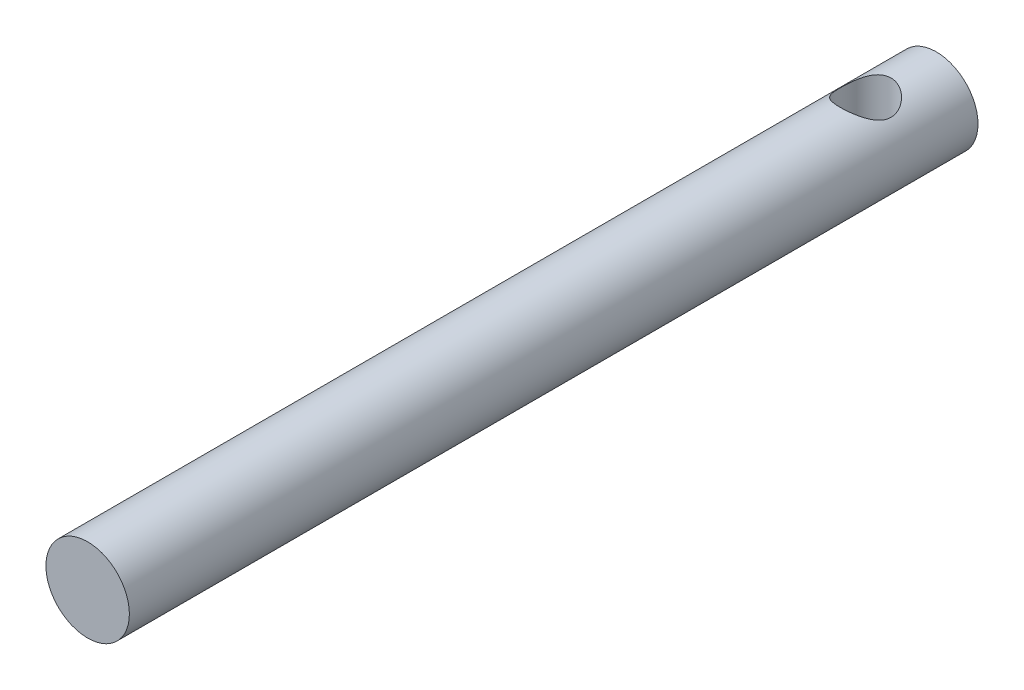
ISO-10303-21;
HEADER;
FILE_DESCRIPTION(('STEP AP214'),'2;1');
FILE_NAME('part.step','',(''),(''),'','','');
FILE_SCHEMA(('AUTOMOTIVE_DESIGN { 1 0 10303 214 1 1 1 1 }'));
ENDSEC;
DATA;
#1=APPLICATION_CONTEXT('core data for automotive mechanical design processes');
#2=APPLICATION_PROTOCOL_DEFINITION('international standard','automotive_design',2000,#1);
#3=PRODUCT_CONTEXT('',#1,'mechanical');
#4=PRODUCT('Part','Part','',(#3));
#5=PRODUCT_RELATED_PRODUCT_CATEGORY('part','',(#4));
#6=PRODUCT_DEFINITION_FORMATION('','',#4);
#7=PRODUCT_DEFINITION_CONTEXT('part definition',#1,'design');
#8=PRODUCT_DEFINITION('design','',#6,#7);
#9=PRODUCT_DEFINITION_SHAPE('','',#8);
#10=(LENGTH_UNIT() NAMED_UNIT(*) SI_UNIT(.MILLI.,.METRE.));
#11=(NAMED_UNIT(*) PLANE_ANGLE_UNIT() SI_UNIT($,.RADIAN.));
#12=(NAMED_UNIT(*) SI_UNIT($,.STERADIAN.) SOLID_ANGLE_UNIT());
#13=UNCERTAINTY_MEASURE_WITH_UNIT(LENGTH_MEASURE(1.E-05),#10,'distance_accuracy_value','');
#14=(GEOMETRIC_REPRESENTATION_CONTEXT(3) GLOBAL_UNCERTAINTY_ASSIGNED_CONTEXT((#13)) GLOBAL_UNIT_ASSIGNED_CONTEXT((#10,
#11,#12)) REPRESENTATION_CONTEXT('',''));
#15=CARTESIAN_POINT('',(0.,0.,0.));
#16=DIRECTION('',(0.,0.,1.));
#17=DIRECTION('',(1.,0.,0.));
#18=AXIS2_PLACEMENT_3D('',#15,#16,#17);
#19=CARTESIAN_POINT('',(0.,0.,30.));
#20=DIRECTION('',(0.,0.,-1.));
#21=DIRECTION('',(-1.,0.,0.));
#22=AXIS2_PLACEMENT_3D('',#19,#20,#21);
#23=CYLINDRICAL_SURFACE('',#22,1.475);
#24=CARTESIAN_POINT('',(0.,-1.475,1.6));
#25=CARTESIAN_POINT('',(0.045912410718425,-1.47499739781624,1.60000282396648));
#26=CARTESIAN_POINT('',(0.0918906411350203,-1.47283334062659,1.60353752520696));
#27=CARTESIAN_POINT('',(0.18245330958013,-1.46438225218298,1.6174921454957));
#28=CARTESIAN_POINT('',(0.227034383095622,-1.45808596620384,1.6279275200008));
#29=CARTESIAN_POINT('',(0.313304140063083,-1.44200615692076,1.65508840059613));
#30=CARTESIAN_POINT('',(0.355005970099901,-1.43223993625315,1.67178271921162));
#31=CARTESIAN_POINT('',(0.434880139104016,-1.41004434466445,1.71078724101004));
#32=CARTESIAN_POINT('',(0.47305315129237,-1.39761548322403,1.73309636997454));
#33=CARTESIAN_POINT('',(0.548150142469809,-1.3699922857903,1.78462309447208));
#34=CARTESIAN_POINT('',(0.58474531215547,-1.35465795887662,1.81424341187486));
#35=CARTESIAN_POINT('',(0.652768811885041,-1.3232253100827,1.87863807763151));
#36=CARTESIAN_POINT('',(0.684190272290478,-1.30712600842079,1.91341916385366));
#37=CARTESIAN_POINT('',(0.745052368152172,-1.2735293980937,1.99236802158991));
#38=CARTESIAN_POINT('',(0.77372695923624,-1.25611628821897,2.03716732231839));
#39=CARTESIAN_POINT('',(0.823041722116036,-1.22437353644703,2.13197179114711));
#40=CARTESIAN_POINT('',(0.843695173022783,-1.21003881597698,2.18196817990094));
#41=CARTESIAN_POINT('',(0.871884946663613,-1.1898170461034,2.27308391757396));
#42=CARTESIAN_POINT('',(0.881406111383083,-1.18271565838487,2.31331827056704));
#43=CARTESIAN_POINT('',(0.894835775662419,-1.17259000152416,2.3951945583327));
#44=CARTESIAN_POINT('',(0.898751628105886,-1.16956039146342,2.43683457562328));
#45=CARTESIAN_POINT('',(0.900741055627678,-1.16802941081863,2.52043265697573));
#46=CARTESIAN_POINT('',(0.898801697803863,-1.16953806425733,2.56239122060057));
#47=CARTESIAN_POINT('',(0.889179584667247,-1.17686832213718,2.64526940981607));
#48=CARTESIAN_POINT('',(0.881492387382832,-1.18269326220435,2.6861882065662));
#49=CARTESIAN_POINT('',(0.860971257540371,-1.19771018790772,2.76527700764001));
#50=CARTESIAN_POINT('',(0.848225520457277,-1.20684425271826,2.80348153080177));
#51=CARTESIAN_POINT('',(0.818067869389553,-1.22748652618408,2.87730209155186));
#52=CARTESIAN_POINT('',(0.800654271259991,-1.23899559138402,2.91291718897871));
#53=CARTESIAN_POINT('',(0.758050540432553,-1.26559138889353,2.98735468972209));
#54=CARTESIAN_POINT('',(0.732025102564108,-1.28094930846075,3.02560219902792));
#55=CARTESIAN_POINT('',(0.674541968943679,-1.31213169292129,3.09759372246431));
#56=CARTESIAN_POINT('',(0.643078906633813,-1.32795660578742,3.13133322862253));
#57=CARTESIAN_POINT('',(0.570040128670051,-1.36107158931453,3.19847475281042));
#58=CARTESIAN_POINT('',(0.527655849433688,-1.3782273365671,3.231073271453));
#59=CARTESIAN_POINT('',(0.436986328542986,-1.40959716899836,3.28861928738479));
#60=CARTESIAN_POINT('',(0.388703960749276,-1.42381267779479,3.31357049021849));
#61=CARTESIAN_POINT('',(0.290456772066477,-1.44694516897145,3.35338831486921));
#62=CARTESIAN_POINT('',(0.240765787912419,-1.4561284410821,3.368769307));
#63=CARTESIAN_POINT('',(0.138836764380501,-1.46934620964456,3.39074821911962));
#64=CARTESIAN_POINT('',(0.0866020855112313,-1.47338731763166,3.39735741790957));
#65=CARTESIAN_POINT('',(-0.010919005991024,-1.47565057122337,3.40106557650627));
#66=CARTESIAN_POINT('',(-0.0561470815826963,-1.47461258753166,3.39937365485107));
#67=CARTESIAN_POINT('',(-0.145563754124123,-1.46848318715587,3.38928862151396));
#68=CARTESIAN_POINT('',(-0.189752390171869,-1.46339192318569,3.3808957623007));
#69=CARTESIAN_POINT('',(-0.274555720840365,-1.44983986943262,3.35819009206027));
#70=CARTESIAN_POINT('',(-0.31523790294338,-1.44148490327936,3.34406270533831));
#71=CARTESIAN_POINT('',(-0.393632533766046,-1.42207978164358,3.31047732275414));
#72=CARTESIAN_POINT('',(-0.431344434255993,-1.41102913014898,3.29101834578622));
#73=CARTESIAN_POINT('',(-0.506931555463584,-1.38578215285621,3.24509917973414));
#74=CARTESIAN_POINT('',(-0.544424149944528,-1.37137913191738,3.21812455711698));
#75=CARTESIAN_POINT('',(-0.61462750952439,-1.34138684731207,3.15904618665705));
#76=CARTESIAN_POINT('',(-0.647332691679655,-1.32579623040128,3.12693654034108));
#77=CARTESIAN_POINT('',(-0.711645362890429,-1.29254284797909,3.05341001508527));
#78=CARTESIAN_POINT('',(-0.742492746430697,-1.27488791842048,3.01132092557166));
#79=CARTESIAN_POINT('',(-0.796738639407176,-1.24171033086351,2.9218279114911));
#80=CARTESIAN_POINT('',(-0.820143993308301,-1.22618572111627,2.87442892504281));
#81=CARTESIAN_POINT('',(-0.854434161442516,-1.202458321459,2.78581253590568));
#82=CARTESIAN_POINT('',(-0.866927705120393,-1.19339930308167,2.74544979372361));
#83=CARTESIAN_POINT('',(-0.88617901237121,-1.17917668903453,2.66273748176355));
#84=CARTESIAN_POINT('',(-0.892945182441607,-1.17400738538052,2.6203909205432));
#85=CARTESIAN_POINT('',(-0.90036556459674,-1.16832832615627,2.53464645457597));
#86=CARTESIAN_POINT('',(-0.900992234529273,-1.16783956800378,2.4912446870257));
#87=CARTESIAN_POINT('',(-0.896015253809096,-1.17166125172246,2.40500518916881));
#88=CARTESIAN_POINT('',(-0.89040863173393,-1.17597398247412,2.36216773772646));
#89=CARTESIAN_POINT('',(-0.873850119593986,-1.18832125074155,2.28090458377368));
#90=CARTESIAN_POINT('',(-0.863243569449701,-1.19611382613041,2.24236895172179));
#91=CARTESIAN_POINT('',(-0.837309432885821,-1.21440883260973,2.16761453356084));
#92=CARTESIAN_POINT('',(-0.82198002522221,-1.22491230883279,2.13139664774707));
#93=CARTESIAN_POINT('',(-0.784384818522681,-1.24937576063502,2.05642921838285));
#94=CARTESIAN_POINT('',(-0.76142119123874,-1.26361817279437,2.01812304906661));
#95=CARTESIAN_POINT('',(-0.710306546712891,-1.29304321815541,1.94552881000137));
#96=CARTESIAN_POINT('',(-0.682151232598696,-1.30822662320314,1.91124410733841));
#97=CARTESIAN_POINT('',(-0.615600647100012,-1.34099515631488,1.84139804121723));
#98=CARTESIAN_POINT('',(-0.576274849452871,-1.3585281910231,1.80669035144105));
#99=CARTESIAN_POINT('',(-0.491554502979244,-1.39142462353589,1.74426152253668));
#100=CARTESIAN_POINT('',(-0.446157205153057,-1.40678703202593,1.71654356465763));
#101=CARTESIAN_POINT('',(-0.351125007448463,-1.43343160826773,1.66965903119075));
#102=CARTESIAN_POINT('',(-0.30158381768821,-1.44478387043299,1.65034402491714));
#103=CARTESIAN_POINT('',(-0.199121780026764,-1.46241307157738,1.62069847372073));
#104=CARTESIAN_POINT('',(-0.146214173626389,-1.46870871182552,1.6103348125707));
#105=CARTESIAN_POINT('',(-0.0773432906016996,-1.47305277175217,1.60319468292426));
#106=CARTESIAN_POINT('',(-0.061910771741185,-1.47378141438055,1.60199835486601));
#107=CARTESIAN_POINT('',(-0.0309880036918317,-1.47475547999557,1.60040051654532));
#108=CARTESIAN_POINT('',(-0.0154977516026058,-1.47500087836811,1.59999904676905));
#109=CARTESIAN_POINT('',(0.,-1.475,1.6));
#110=B_SPLINE_CURVE_WITH_KNOTS('',3,(#24,#25,#26,#27,#28,#29,#30,#31,#32,#33,#34,#35,#36,#37,
#38,#39,#40,#41,#42,#43,#44,#45,#46,#47,#48,#49,#50,#51,#52,#53,#54,#55,#56,#57,#58,#59,#60,#61,
#62,#63,#64,#65,#66,#67,#68,#69,#70,#71,#72,#73,#74,#75,#76,#77,#78,#79,#80,#81,#82,#83,#84,#85,
#86,#87,#88,#89,#90,#91,#92,#93,#94,#95,#96,#97,#98,#99,#100,#101,#102,#103,#104,#105,#106,#107,
#108,#109),.UNSPECIFIED.,.T.,.F.,(4,2,2,2,2,2,2,2,2,2,2,2,2,2,2,2,2,2,2,2,2,2,2,2,2,2,2,2,2,2,2,
2,2,2,2,2,2,2,2,2,2,2,4),(0.,0.137671373197759,0.275652138446507,0.412954309757495,
0.550230232532347,0.698197281270155,0.846359243002762,1.01345176377855,1.18026646918554,
1.30559065859607,1.43075030029664,1.55618659486738,1.68171992782832,1.80515450513333,
1.9286336772046,2.07431699364688,2.22014491915035,2.3877595470396,2.55529282756166,
2.7127948999977,2.87009425891075,3.00522320578742,3.14034706170315,3.27141147679101,
3.4025000262368,3.54707970639368,3.69182667051561,3.85634457417932,4.02071072944281,
4.14982300404076,4.27874544059574,4.40824596724119,4.53780825352006,4.65950127986928,
4.78124129274972,4.92136188286104,5.06159896785218,5.22672940409484,5.39193486135096,
5.55409023827361,5.7156431066518,5.76211176391982,5.80858278801162),.UNSPECIFIED.);
#111=CARTESIAN_POINT('',(0.,-1.475,1.6));
#112=VERTEX_POINT('',#111);
#113=EDGE_CURVE('E62',#112,#112,#110,.T.);
#114=ORIENTED_EDGE('',*,*,#113,.F.);
#115=EDGE_LOOP('',(#114));
#116=FACE_BOUND('',#115,.T.);
#117=CARTESIAN_POINT('',(0.,0.,30.));
#118=DIRECTION('',(0.,0.,1.));
#119=DIRECTION('',(1.,0.,0.));
#120=AXIS2_PLACEMENT_3D('',#117,#118,#119);
#121=CIRCLE('',#120,1.475);
#122=CARTESIAN_POINT('',(1.475,0.,30.));
#123=VERTEX_POINT('',#122);
#124=EDGE_CURVE('E12',#123,#123,#121,.T.);
#125=ORIENTED_EDGE('',*,*,#124,.F.);
#126=EDGE_LOOP('',(#125));
#127=FACE_BOUND('',#126,.T.);
#128=CARTESIAN_POINT('',(0.,0.,0.));
#129=DIRECTION('',(0.,0.,1.));
#130=DIRECTION('',(1.,0.,0.));
#131=AXIS2_PLACEMENT_3D('',#128,#129,#130);
#132=CIRCLE('',#131,1.475);
#133=CARTESIAN_POINT('',(1.475,0.,0.));
#134=VERTEX_POINT('',#133);
#135=EDGE_CURVE('E56',#134,#134,#132,.T.);
#136=ORIENTED_EDGE('',*,*,#135,.T.);
#137=EDGE_LOOP('',(#136));
#138=FACE_BOUND('',#137,.T.);
#139=CARTESIAN_POINT('',(0.,1.475,1.6));
#140=CARTESIAN_POINT('',(-0.045912410718425,1.47499739781624,1.60000282396648));
#141=CARTESIAN_POINT('',(-0.0918906411350203,1.47283334062659,1.60353752520696));
#142=CARTESIAN_POINT('',(-0.18245330958013,1.46438225218298,1.6174921454957));
#143=CARTESIAN_POINT('',(-0.227034383095622,1.45808596620384,1.6279275200008));
#144=CARTESIAN_POINT('',(-0.313304140063083,1.44200615692076,1.65508840059613));
#145=CARTESIAN_POINT('',(-0.355005970099901,1.43223993625315,1.67178271921162));
#146=CARTESIAN_POINT('',(-0.434880139104016,1.41004434466445,1.71078724101004));
#147=CARTESIAN_POINT('',(-0.47305315129237,1.39761548322403,1.73309636997454));
#148=CARTESIAN_POINT('',(-0.548150142469809,1.3699922857903,1.78462309447208));
#149=CARTESIAN_POINT('',(-0.58474531215547,1.35465795887662,1.81424341187486));
#150=CARTESIAN_POINT('',(-0.652768811885041,1.3232253100827,1.87863807763151));
#151=CARTESIAN_POINT('',(-0.684190272290478,1.30712600842079,1.91341916385366));
#152=CARTESIAN_POINT('',(-0.745052368152172,1.2735293980937,1.99236802158991));
#153=CARTESIAN_POINT('',(-0.77372695923624,1.25611628821897,2.03716732231839));
#154=CARTESIAN_POINT('',(-0.823041722116036,1.22437353644703,2.13197179114711));
#155=CARTESIAN_POINT('',(-0.843695173022783,1.21003881597698,2.18196817990094));
#156=CARTESIAN_POINT('',(-0.871884946663613,1.1898170461034,2.27308391757396));
#157=CARTESIAN_POINT('',(-0.881406111383083,1.18271565838487,2.31331827056704));
#158=CARTESIAN_POINT('',(-0.894835775662419,1.17259000152416,2.3951945583327));
#159=CARTESIAN_POINT('',(-0.898751628105886,1.16956039146342,2.43683457562328));
#160=CARTESIAN_POINT('',(-0.900741055627678,1.16802941081863,2.52043265697573));
#161=CARTESIAN_POINT('',(-0.898801697803863,1.16953806425733,2.56239122060057));
#162=CARTESIAN_POINT('',(-0.889179584667247,1.17686832213718,2.64526940981607));
#163=CARTESIAN_POINT('',(-0.881492387382832,1.18269326220435,2.6861882065662));
#164=CARTESIAN_POINT('',(-0.860971257540371,1.19771018790772,2.76527700764001));
#165=CARTESIAN_POINT('',(-0.848225520457277,1.20684425271826,2.80348153080177));
#166=CARTESIAN_POINT('',(-0.818067869389553,1.22748652618408,2.87730209155186));
#167=CARTESIAN_POINT('',(-0.800654271259991,1.23899559138402,2.91291718897871));
#168=CARTESIAN_POINT('',(-0.758050540432553,1.26559138889353,2.98735468972209));
#169=CARTESIAN_POINT('',(-0.732025102564108,1.28094930846075,3.02560219902792));
#170=CARTESIAN_POINT('',(-0.674541968943679,1.31213169292129,3.09759372246431));
#171=CARTESIAN_POINT('',(-0.643078906633813,1.32795660578742,3.13133322862253));
#172=CARTESIAN_POINT('',(-0.570040128670051,1.36107158931453,3.19847475281042));
#173=CARTESIAN_POINT('',(-0.527655849433688,1.3782273365671,3.231073271453));
#174=CARTESIAN_POINT('',(-0.436986328542986,1.40959716899836,3.28861928738479));
#175=CARTESIAN_POINT('',(-0.388703960749276,1.42381267779479,3.31357049021849));
#176=CARTESIAN_POINT('',(-0.290456772066477,1.44694516897145,3.35338831486921));
#177=CARTESIAN_POINT('',(-0.240765787912419,1.4561284410821,3.368769307));
#178=CARTESIAN_POINT('',(-0.138836764380501,1.46934620964456,3.39074821911962));
#179=CARTESIAN_POINT('',(-0.0866020855112313,1.47338731763166,3.39735741790957));
#180=CARTESIAN_POINT('',(0.010919005991024,1.47565057122337,3.40106557650627));
#181=CARTESIAN_POINT('',(0.0561470815826963,1.47461258753166,3.39937365485107));
#182=CARTESIAN_POINT('',(0.145563754124123,1.46848318715587,3.38928862151396));
#183=CARTESIAN_POINT('',(0.189752390171869,1.46339192318569,3.3808957623007));
#184=CARTESIAN_POINT('',(0.274555720840365,1.44983986943262,3.35819009206027));
#185=CARTESIAN_POINT('',(0.31523790294338,1.44148490327936,3.34406270533831));
#186=CARTESIAN_POINT('',(0.393632533766046,1.42207978164358,3.31047732275414));
#187=CARTESIAN_POINT('',(0.431344434255993,1.41102913014898,3.29101834578622));
#188=CARTESIAN_POINT('',(0.506931555463584,1.38578215285621,3.24509917973414));
#189=CARTESIAN_POINT('',(0.544424149944528,1.37137913191738,3.21812455711698));
#190=CARTESIAN_POINT('',(0.61462750952439,1.34138684731207,3.15904618665705));
#191=CARTESIAN_POINT('',(0.647332691679655,1.32579623040128,3.12693654034108));
#192=CARTESIAN_POINT('',(0.711645362890429,1.29254284797909,3.05341001508527));
#193=CARTESIAN_POINT('',(0.742492746430697,1.27488791842048,3.01132092557166));
#194=CARTESIAN_POINT('',(0.796738639407176,1.24171033086351,2.9218279114911));
#195=CARTESIAN_POINT('',(0.820143993308301,1.22618572111627,2.87442892504281));
#196=CARTESIAN_POINT('',(0.854434161442516,1.202458321459,2.78581253590568));
#197=CARTESIAN_POINT('',(0.866927705120393,1.19339930308167,2.74544979372361));
#198=CARTESIAN_POINT('',(0.88617901237121,1.17917668903453,2.66273748176355));
#199=CARTESIAN_POINT('',(0.892945182441607,1.17400738538052,2.6203909205432));
#200=CARTESIAN_POINT('',(0.90036556459674,1.16832832615627,2.53464645457597));
#201=CARTESIAN_POINT('',(0.900992234529273,1.16783956800378,2.4912446870257));
#202=CARTESIAN_POINT('',(0.896015253809096,1.17166125172246,2.40500518916881));
#203=CARTESIAN_POINT('',(0.89040863173393,1.17597398247412,2.36216773772646));
#204=CARTESIAN_POINT('',(0.873850119593986,1.18832125074155,2.28090458377368));
#205=CARTESIAN_POINT('',(0.863243569449701,1.19611382613041,2.24236895172179));
#206=CARTESIAN_POINT('',(0.837309432885821,1.21440883260973,2.16761453356084));
#207=CARTESIAN_POINT('',(0.82198002522221,1.22491230883279,2.13139664774707));
#208=CARTESIAN_POINT('',(0.784384818522681,1.24937576063502,2.05642921838285));
#209=CARTESIAN_POINT('',(0.76142119123874,1.26361817279437,2.01812304906661));
#210=CARTESIAN_POINT('',(0.710306546712891,1.29304321815541,1.94552881000137));
#211=CARTESIAN_POINT('',(0.682151232598696,1.30822662320314,1.91124410733841));
#212=CARTESIAN_POINT('',(0.615600647100012,1.34099515631488,1.84139804121723));
#213=CARTESIAN_POINT('',(0.576274849452871,1.3585281910231,1.80669035144105));
#214=CARTESIAN_POINT('',(0.491554502979244,1.39142462353589,1.74426152253668));
#215=CARTESIAN_POINT('',(0.446157205153057,1.40678703202593,1.71654356465763));
#216=CARTESIAN_POINT('',(0.351125007448463,1.43343160826773,1.66965903119075));
#217=CARTESIAN_POINT('',(0.30158381768821,1.44478387043299,1.65034402491714));
#218=CARTESIAN_POINT('',(0.199121780026764,1.46241307157738,1.62069847372073));
#219=CARTESIAN_POINT('',(0.146214173626389,1.46870871182552,1.6103348125707));
#220=CARTESIAN_POINT('',(0.0773432906016996,1.47305277175217,1.60319468292426));
#221=CARTESIAN_POINT('',(0.061910771741185,1.47378141438055,1.60199835486601));
#222=CARTESIAN_POINT('',(0.0309880036918317,1.47475547999557,1.60040051654532));
#223=CARTESIAN_POINT('',(0.0154977516026058,1.47500087836811,1.59999904676905));
#224=CARTESIAN_POINT('',(0.,1.475,1.6));
#225=B_SPLINE_CURVE_WITH_KNOTS('',3,(#139,#140,#141,#142,#143,#144,#145,#146,#147,#148,#149,
#150,#151,#152,#153,#154,#155,#156,#157,#158,#159,#160,#161,#162,#163,#164,#165,#166,#167,#168,
#169,#170,#171,#172,#173,#174,#175,#176,#177,#178,#179,#180,#181,#182,#183,#184,#185,#186,#187,
#188,#189,#190,#191,#192,#193,#194,#195,#196,#197,#198,#199,#200,#201,#202,#203,#204,#205,#206,
#207,#208,#209,#210,#211,#212,#213,#214,#215,#216,#217,#218,#219,#220,#221,#222,#223,#224),
.UNSPECIFIED.,.T.,.F.,(4,2,2,2,2,2,2,2,2,2,2,2,2,2,2,2,2,2,2,2,2,2,2,2,2,2,2,2,2,2,2,2,2,2,2,2,
2,2,2,2,2,2,4),(0.,0.137671373197759,0.275652138446507,0.412954309757495,0.550230232532347,
0.698197281270155,0.846359243002762,1.01345176377855,1.18026646918554,1.30559065859607,
1.43075030029664,1.55618659486738,1.68171992782832,1.80515450513333,1.9286336772046,
2.07431699364688,2.22014491915035,2.3877595470396,2.55529282756166,2.7127948999977,
2.87009425891075,3.00522320578742,3.14034706170315,3.27141147679101,3.4025000262368,
3.54707970639368,3.69182667051561,3.85634457417932,4.02071072944281,4.14982300404076,
4.27874544059574,4.40824596724119,4.53780825352006,4.65950127986928,4.78124129274972,
4.92136188286104,5.06159896785218,5.22672940409484,5.39193486135096,5.55409023827361,
5.7156431066518,5.76211176391982,5.80858278801162),.UNSPECIFIED.);
#226=CARTESIAN_POINT('',(0.,1.475,1.6));
#227=VERTEX_POINT('',#226);
#228=EDGE_CURVE('E49',#227,#227,#225,.T.);
#229=ORIENTED_EDGE('',*,*,#228,.F.);
#230=EDGE_LOOP('',(#229));
#231=FACE_BOUND('',#230,.T.);
#232=ADVANCED_FACE('F45',(#116,#127,#138,#231),#23,.T.);
#233=CARTESIAN_POINT('',(0.,0.,30.));
#234=DIRECTION('',(0.,0.,1.));
#235=DIRECTION('',(1.,0.,0.));
#236=AXIS2_PLACEMENT_3D('',#233,#234,#235);
#237=PLANE('',#236);
#238=ORIENTED_EDGE('',*,*,#124,.T.);
#239=EDGE_LOOP('',(#238));
#240=FACE_BOUND('',#239,.T.);
#241=ADVANCED_FACE('F72',(#240),#237,.T.);
#242=CARTESIAN_POINT('',(0.,0.,0.));
#243=DIRECTION('',(0.,0.,1.));
#244=DIRECTION('',(1.,0.,0.));
#245=AXIS2_PLACEMENT_3D('',#242,#243,#244);
#246=PLANE('',#245);
#247=ORIENTED_EDGE('',*,*,#135,.F.);
#248=EDGE_LOOP('',(#247));
#249=FACE_BOUND('',#248,.T.);
#250=ADVANCED_FACE('F70',(#249),#246,.F.);
#251=CARTESIAN_POINT('',(0.,10.,2.5));
#252=DIRECTION('',(0.,-1.,0.));
#253=DIRECTION('',(0.,0.,-1.));
#254=AXIS2_PLACEMENT_3D('',#251,#252,#253);
#255=CYLINDRICAL_SURFACE('',#254,0.9);
#256=ORIENTED_EDGE('',*,*,#113,.T.);
#257=EDGE_LOOP('',(#256));
#258=FACE_BOUND('',#257,.T.);
#259=ORIENTED_EDGE('',*,*,#228,.T.);
#260=EDGE_LOOP('',(#259));
#261=FACE_BOUND('',#260,.T.);
#262=ADVANCED_FACE('F66',(#258,#261),#255,.F.);
#263=CLOSED_SHELL('',(#232,#241,#250,#262));
#264=MANIFOLD_SOLID_BREP('B2',#263);
#265=ADVANCED_BREP_SHAPE_REPRESENTATION('',(#18,#264),#14);
#266=SHAPE_DEFINITION_REPRESENTATION(#9,#265);
ENDSEC;
END-ISO-10303-21;
